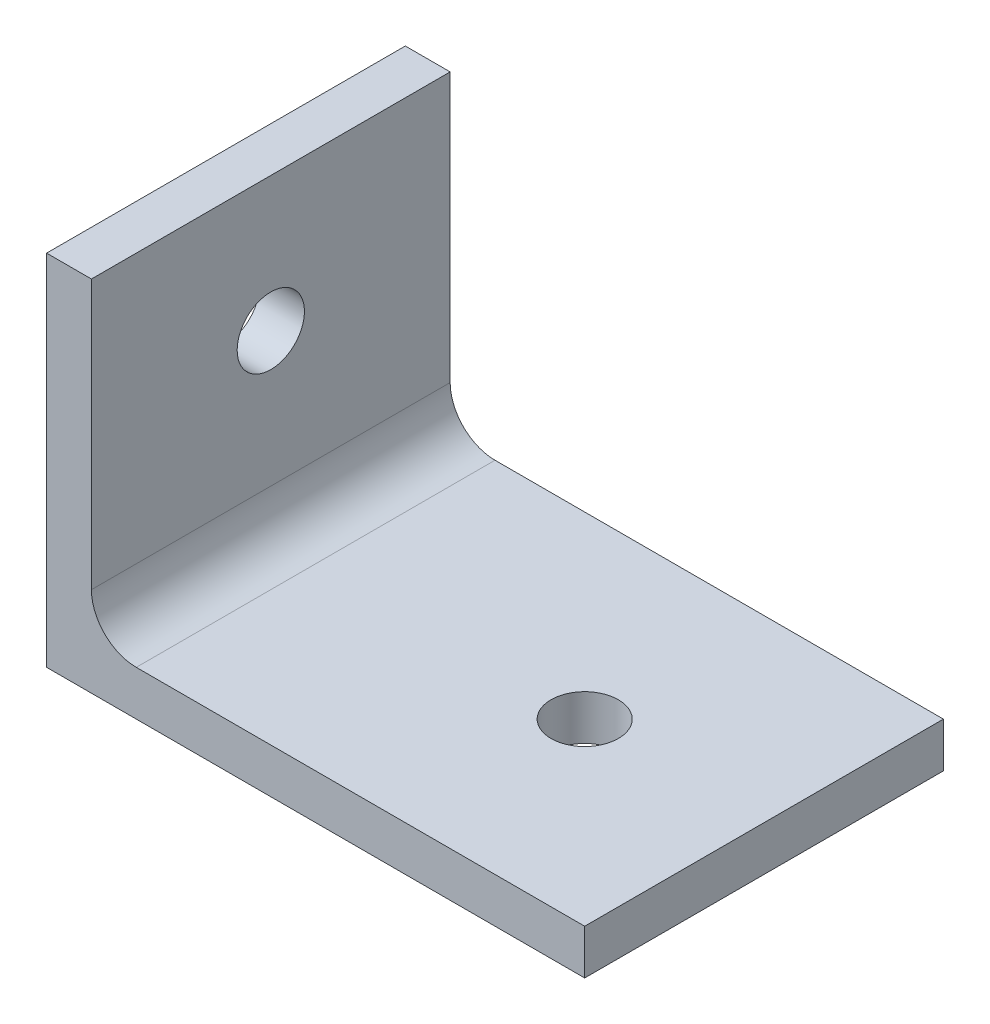
ISO-10303-21;
HEADER;
FILE_DESCRIPTION(('STEP AP214'),'2;1');
FILE_NAME('part.step','',(''),(''),'','','');
FILE_SCHEMA(('AUTOMOTIVE_DESIGN { 1 0 10303 214 1 1 1 1 }'));
ENDSEC;
DATA;
#1=APPLICATION_CONTEXT('core data for automotive mechanical design processes');
#2=APPLICATION_PROTOCOL_DEFINITION('international standard','automotive_design',2000,#1);
#3=PRODUCT_CONTEXT('',#1,'mechanical');
#4=PRODUCT('Part','Part','',(#3));
#5=PRODUCT_RELATED_PRODUCT_CATEGORY('part','',(#4));
#6=PRODUCT_DEFINITION_FORMATION('','',#4);
#7=PRODUCT_DEFINITION_CONTEXT('part definition',#1,'design');
#8=PRODUCT_DEFINITION('design','',#6,#7);
#9=PRODUCT_DEFINITION_SHAPE('','',#8);
#10=(LENGTH_UNIT() NAMED_UNIT(*) SI_UNIT(.MILLI.,.METRE.));
#11=(NAMED_UNIT(*) PLANE_ANGLE_UNIT() SI_UNIT($,.RADIAN.));
#12=(NAMED_UNIT(*) SI_UNIT($,.STERADIAN.) SOLID_ANGLE_UNIT());
#13=UNCERTAINTY_MEASURE_WITH_UNIT(LENGTH_MEASURE(1.E-05),#10,'distance_accuracy_value','');
#14=(GEOMETRIC_REPRESENTATION_CONTEXT(3) GLOBAL_UNCERTAINTY_ASSIGNED_CONTEXT((#13)) GLOBAL_UNIT_ASSIGNED_CONTEXT((#10,
#11,#12)) REPRESENTATION_CONTEXT('',''));
#15=CARTESIAN_POINT('',(0.,0.,0.));
#16=DIRECTION('',(0.,0.,1.));
#17=DIRECTION('',(1.,0.,0.));
#18=AXIS2_PLACEMENT_3D('',#15,#16,#17);
#19=CARTESIAN_POINT('',(0.,50.8,25.4));
#20=DIRECTION('',(1.,0.,0.));
#21=DIRECTION('',(0.,1.,0.));
#22=AXIS2_PLACEMENT_3D('',#19,#20,#21);
#23=PLANE('',#22);
#24=CARTESIAN_POINT('',(0.,31.75,0.));
#25=DIRECTION('',(-1.,0.,0.));
#26=DIRECTION('',(0.,0.,1.));
#27=AXIS2_PLACEMENT_3D('',#24,#25,#26);
#28=CIRCLE('',#27,4.7625);
#29=CARTESIAN_POINT('',(0.,31.75,4.7625));
#30=VERTEX_POINT('',#29);
#31=EDGE_CURVE('E161',#30,#30,#28,.T.);
#32=ORIENTED_EDGE('',*,*,#31,.F.);
#33=EDGE_LOOP('',(#32));
#34=FACE_BOUND('',#33,.T.);
#35=DIRECTION('',(0.,-1.,0.));
#36=VECTOR('',#35,1.);
#37=CARTESIAN_POINT('',(0.,50.8,-25.4));
#38=LINE('',#37,#36);
#39=CARTESIAN_POINT('',(0.,50.8,-25.4));
#40=VERTEX_POINT('',#39);
#41=CARTESIAN_POINT('',(0.,0.,-25.4));
#42=VERTEX_POINT('',#41);
#43=EDGE_CURVE('E125',#40,#42,#38,.T.);
#44=ORIENTED_EDGE('',*,*,#43,.T.);
#45=DIRECTION('',(0.,0.,-1.));
#46=VECTOR('',#45,1.);
#47=CARTESIAN_POINT('',(0.,0.,25.4));
#48=LINE('',#47,#46);
#49=CARTESIAN_POINT('',(0.,0.,25.4));
#50=VERTEX_POINT('',#49);
#51=EDGE_CURVE('E103',#50,#42,#48,.T.);
#52=ORIENTED_EDGE('',*,*,#51,.F.);
#53=DIRECTION('',(0.,-1.,0.));
#54=VECTOR('',#53,1.);
#55=CARTESIAN_POINT('',(0.,50.8,25.4));
#56=LINE('',#55,#54);
#57=CARTESIAN_POINT('',(0.,50.8,25.4));
#58=VERTEX_POINT('',#57);
#59=EDGE_CURVE('E109',#58,#50,#56,.T.);
#60=ORIENTED_EDGE('',*,*,#59,.F.);
#61=DIRECTION('',(0.,0.,-1.));
#62=VECTOR('',#61,1.);
#63=CARTESIAN_POINT('',(0.,50.8,25.4));
#64=LINE('',#63,#62);
#65=EDGE_CURVE('E140',#58,#40,#64,.T.);
#66=ORIENTED_EDGE('',*,*,#65,.T.);
#67=EDGE_LOOP('',(#44,#52,#60,#66));
#68=FACE_BOUND('',#67,.T.);
#69=ADVANCED_FACE('F39',(#34,#68),#23,.F.);
#70=CARTESIAN_POINT('',(0.,0.,25.4));
#71=DIRECTION('',(0.,1.,0.));
#72=DIRECTION('',(0.,0.,1.));
#73=AXIS2_PLACEMENT_3D('',#70,#71,#72);
#74=PLANE('',#73);
#75=CARTESIAN_POINT('',(50.8,0.,0.));
#76=DIRECTION('',(0.,1.,0.));
#77=DIRECTION('',(-1.,0.,0.));
#78=AXIS2_PLACEMENT_3D('',#75,#76,#77);
#79=CIRCLE('',#78,4.7625);
#80=CARTESIAN_POINT('',(46.0375,0.,0.));
#81=VERTEX_POINT('',#80);
#82=EDGE_CURVE('E149',#81,#81,#79,.T.);
#83=ORIENTED_EDGE('',*,*,#82,.T.);
#84=EDGE_LOOP('',(#83));
#85=FACE_BOUND('',#84,.T.);
#86=DIRECTION('',(1.,0.,0.));
#87=VECTOR('',#86,1.);
#88=CARTESIAN_POINT('',(0.,0.,-25.4));
#89=LINE('',#88,#87);
#90=CARTESIAN_POINT('',(76.2,0.,-25.4));
#91=VERTEX_POINT('',#90);
#92=EDGE_CURVE('E148',#42,#91,#89,.T.);
#93=ORIENTED_EDGE('',*,*,#92,.T.);
#94=DIRECTION('',(0.,0.,-1.));
#95=VECTOR('',#94,1.);
#96=CARTESIAN_POINT('',(76.2,0.,25.4));
#97=LINE('',#96,#95);
#98=CARTESIAN_POINT('',(76.2,0.,25.4));
#99=VERTEX_POINT('',#98);
#100=EDGE_CURVE('E106',#99,#91,#97,.T.);
#101=ORIENTED_EDGE('',*,*,#100,.F.);
#102=DIRECTION('',(1.,0.,0.));
#103=VECTOR('',#102,1.);
#104=CARTESIAN_POINT('',(0.,0.,25.4));
#105=LINE('',#104,#103);
#106=EDGE_CURVE('E97',#50,#99,#105,.T.);
#107=ORIENTED_EDGE('',*,*,#106,.F.);
#108=ORIENTED_EDGE('',*,*,#51,.T.);
#109=EDGE_LOOP('',(#93,#101,#107,#108));
#110=FACE_BOUND('',#109,.T.);
#111=ADVANCED_FACE('F101',(#85,#110),#74,.F.);
#112=CARTESIAN_POINT('',(76.2,0.,25.4));
#113=DIRECTION('',(-1.,0.,0.));
#114=DIRECTION('',(0.,0.,1.));
#115=AXIS2_PLACEMENT_3D('',#112,#113,#114);
#116=PLANE('',#115);
#117=DIRECTION('',(0.,1.,0.));
#118=VECTOR('',#117,1.);
#119=CARTESIAN_POINT('',(76.2,0.,-25.4));
#120=LINE('',#119,#118);
#121=CARTESIAN_POINT('',(76.2,6.35,-25.4));
#122=VERTEX_POINT('',#121);
#123=EDGE_CURVE('E145',#91,#122,#120,.T.);
#124=ORIENTED_EDGE('',*,*,#123,.T.);
#125=DIRECTION('',(0.,0.,-1.));
#126=VECTOR('',#125,1.);
#127=CARTESIAN_POINT('',(76.2,6.35,25.4));
#128=LINE('',#127,#126);
#129=CARTESIAN_POINT('',(76.2,6.35,25.4));
#130=VERTEX_POINT('',#129);
#131=EDGE_CURVE('E130',#130,#122,#128,.T.);
#132=ORIENTED_EDGE('',*,*,#131,.F.);
#133=DIRECTION('',(0.,1.,0.));
#134=VECTOR('',#133,1.);
#135=CARTESIAN_POINT('',(76.2,0.,25.4));
#136=LINE('',#135,#134);
#137=EDGE_CURVE('E108',#99,#130,#136,.T.);
#138=ORIENTED_EDGE('',*,*,#137,.F.);
#139=ORIENTED_EDGE('',*,*,#100,.T.);
#140=EDGE_LOOP('',(#124,#132,#138,#139));
#141=FACE_BOUND('',#140,.T.);
#142=ADVANCED_FACE('F187',(#141),#116,.F.);
#143=CARTESIAN_POINT('',(76.2,6.35,25.4));
#144=DIRECTION('',(0.,-1.,0.));
#145=DIRECTION('',(1.,0.,0.));
#146=AXIS2_PLACEMENT_3D('',#143,#144,#145);
#147=PLANE('',#146);
#148=CARTESIAN_POINT('',(50.8,6.35,0.));
#149=DIRECTION('',(0.,1.,0.));
#150=DIRECTION('',(-1.,0.,0.));
#151=AXIS2_PLACEMENT_3D('',#148,#149,#150);
#152=CIRCLE('',#151,4.7625);
#153=CARTESIAN_POINT('',(46.0375,6.35,0.));
#154=VERTEX_POINT('',#153);
#155=EDGE_CURVE('E156',#154,#154,#152,.T.);
#156=ORIENTED_EDGE('',*,*,#155,.F.);
#157=EDGE_LOOP('',(#156));
#158=FACE_BOUND('',#157,.T.);
#159=DIRECTION('',(-1.,0.,0.));
#160=VECTOR('',#159,1.);
#161=CARTESIAN_POINT('',(76.2,6.35,-25.4));
#162=LINE('',#161,#160);
#163=CARTESIAN_POINT('',(12.7,6.35,-25.4));
#164=VERTEX_POINT('',#163);
#165=EDGE_CURVE('E142',#122,#164,#162,.T.);
#166=ORIENTED_EDGE('',*,*,#165,.T.);
#167=DIRECTION('',(0.,0.,-1.));
#168=VECTOR('',#167,1.);
#169=CARTESIAN_POINT('',(12.7,6.35,25.4));
#170=LINE('',#169,#168);
#171=CARTESIAN_POINT('',(12.7,6.35,25.4));
#172=VERTEX_POINT('',#171);
#173=EDGE_CURVE('E54',#164,#172,#170,.F.);
#174=ORIENTED_EDGE('',*,*,#173,.T.);
#175=DIRECTION('',(-1.,0.,0.));
#176=VECTOR('',#175,1.);
#177=CARTESIAN_POINT('',(76.2,6.35,25.4));
#178=LINE('',#177,#176);
#179=EDGE_CURVE('E153',#130,#172,#178,.T.);
#180=ORIENTED_EDGE('',*,*,#179,.F.);
#181=ORIENTED_EDGE('',*,*,#131,.T.);
#182=EDGE_LOOP('',(#166,#174,#180,#181));
#183=FACE_BOUND('',#182,.T.);
#184=ADVANCED_FACE('F195',(#158,#183),#147,.F.);
#185=CARTESIAN_POINT('',(6.35000000000001,6.35,25.4));
#186=DIRECTION('',(-1.,0.,0.));
#187=DIRECTION('',(0.,-1.,0.));
#188=AXIS2_PLACEMENT_3D('',#185,#186,#187);
#189=PLANE('',#188);
#190=CARTESIAN_POINT('',(6.34999999999999,31.75,0.));
#191=DIRECTION('',(-1.,0.,0.));
#192=DIRECTION('',(0.,-1.,0.));
#193=AXIS2_PLACEMENT_3D('',#190,#191,#192);
#194=CIRCLE('',#193,4.7625);
#195=CARTESIAN_POINT('',(6.34999999999999,31.75,4.7625));
#196=VERTEX_POINT('',#195);
#197=EDGE_CURVE('E43',#196,#196,#194,.T.);
#198=ORIENTED_EDGE('',*,*,#197,.T.);
#199=EDGE_LOOP('',(#198));
#200=FACE_BOUND('',#199,.T.);
#201=DIRECTION('',(0.,1.,0.));
#202=VECTOR('',#201,1.);
#203=CARTESIAN_POINT('',(6.35000000000001,6.35,25.4));
#204=LINE('',#203,#202);
#205=CARTESIAN_POINT('',(6.35000000000001,12.7,25.4));
#206=VERTEX_POINT('',#205);
#207=CARTESIAN_POINT('',(6.35,50.8,25.4));
#208=VERTEX_POINT('',#207);
#209=EDGE_CURVE('E151',#206,#208,#204,.T.);
#210=ORIENTED_EDGE('',*,*,#209,.F.);
#211=DIRECTION('',(0.,0.,-1.));
#212=VECTOR('',#211,1.);
#213=CARTESIAN_POINT('',(6.35000000000001,12.7,-25.4));
#214=LINE('',#213,#212);
#215=CARTESIAN_POINT('',(6.35000000000001,12.7,-25.4));
#216=VERTEX_POINT('',#215);
#217=EDGE_CURVE('E124',#206,#216,#214,.T.);
#218=ORIENTED_EDGE('',*,*,#217,.T.);
#219=DIRECTION('',(0.,1.,0.));
#220=VECTOR('',#219,1.);
#221=CARTESIAN_POINT('',(6.35000000000001,6.35,-25.4));
#222=LINE('',#221,#220);
#223=CARTESIAN_POINT('',(6.35,50.8,-25.4));
#224=VERTEX_POINT('',#223);
#225=EDGE_CURVE('E138',#216,#224,#222,.T.);
#226=ORIENTED_EDGE('',*,*,#225,.T.);
#227=DIRECTION('',(0.,0.,-1.));
#228=VECTOR('',#227,1.);
#229=CARTESIAN_POINT('',(6.35,50.8,25.4));
#230=LINE('',#229,#228);
#231=EDGE_CURVE('E131',#208,#224,#230,.T.);
#232=ORIENTED_EDGE('',*,*,#231,.F.);
#233=EDGE_LOOP('',(#210,#218,#226,#232));
#234=FACE_BOUND('',#233,.T.);
#235=ADVANCED_FACE('F169',(#200,#234),#189,.F.);
#236=CARTESIAN_POINT('',(6.35,50.8,25.4));
#237=DIRECTION('',(0.,-1.,0.));
#238=DIRECTION('',(0.,0.,-1.));
#239=AXIS2_PLACEMENT_3D('',#236,#237,#238);
#240=PLANE('',#239);
#241=DIRECTION('',(-1.,0.,0.));
#242=VECTOR('',#241,1.);
#243=CARTESIAN_POINT('',(6.35,50.8,-25.4));
#244=LINE('',#243,#242);
#245=EDGE_CURVE('E116',#224,#40,#244,.T.);
#246=ORIENTED_EDGE('',*,*,#245,.T.);
#247=ORIENTED_EDGE('',*,*,#65,.F.);
#248=DIRECTION('',(-1.,0.,0.));
#249=VECTOR('',#248,1.);
#250=CARTESIAN_POINT('',(6.35,50.8,25.4));
#251=LINE('',#250,#249);
#252=EDGE_CURVE('E113',#208,#58,#251,.T.);
#253=ORIENTED_EDGE('',*,*,#252,.F.);
#254=ORIENTED_EDGE('',*,*,#231,.T.);
#255=EDGE_LOOP('',(#246,#247,#253,#254));
#256=FACE_BOUND('',#255,.T.);
#257=ADVANCED_FACE('F196',(#256),#240,.F.);
#258=CARTESIAN_POINT('',(0.,0.,25.4));
#259=DIRECTION('',(0.,0.,1.));
#260=DIRECTION('',(1.,0.,0.));
#261=AXIS2_PLACEMENT_3D('',#258,#259,#260);
#262=PLANE('',#261);
#263=ORIENTED_EDGE('',*,*,#59,.T.);
#264=ORIENTED_EDGE('',*,*,#106,.T.);
#265=ORIENTED_EDGE('',*,*,#137,.T.);
#266=ORIENTED_EDGE('',*,*,#179,.T.);
#267=CARTESIAN_POINT('',(12.7,12.7,25.4));
#268=DIRECTION('',(0.,0.,1.));
#269=DIRECTION('',(1.,0.,0.));
#270=AXIS2_PLACEMENT_3D('',#267,#268,#269);
#271=CIRCLE('',#270,6.35);
#272=EDGE_CURVE('E11',#172,#206,#271,.F.);
#273=ORIENTED_EDGE('',*,*,#272,.T.);
#274=ORIENTED_EDGE('',*,*,#209,.T.);
#275=ORIENTED_EDGE('',*,*,#252,.T.);
#276=EDGE_LOOP('',(#263,#264,#265,#266,#273,#274,#275));
#277=FACE_BOUND('',#276,.T.);
#278=ADVANCED_FACE('F114',(#277),#262,.T.);
#279=CARTESIAN_POINT('',(0.,0.,-25.4));
#280=DIRECTION('',(0.,0.,1.));
#281=DIRECTION('',(1.,0.,0.));
#282=AXIS2_PLACEMENT_3D('',#279,#280,#281);
#283=PLANE('',#282);
#284=ORIENTED_EDGE('',*,*,#43,.F.);
#285=ORIENTED_EDGE('',*,*,#245,.F.);
#286=ORIENTED_EDGE('',*,*,#225,.F.);
#287=CARTESIAN_POINT('',(12.7,12.7,-25.4));
#288=DIRECTION('',(0.,0.,1.));
#289=DIRECTION('',(1.,0.,0.));
#290=AXIS2_PLACEMENT_3D('',#287,#288,#289);
#291=CIRCLE('',#290,6.35);
#292=EDGE_CURVE('E48',#216,#164,#291,.T.);
#293=ORIENTED_EDGE('',*,*,#292,.T.);
#294=ORIENTED_EDGE('',*,*,#165,.F.);
#295=ORIENTED_EDGE('',*,*,#123,.F.);
#296=ORIENTED_EDGE('',*,*,#92,.F.);
#297=EDGE_LOOP('',(#284,#285,#286,#293,#294,#295,#296));
#298=FACE_BOUND('',#297,.T.);
#299=ADVANCED_FACE('F205',(#298),#283,.F.);
#300=CARTESIAN_POINT('',(12.7,12.7,25.4));
#301=DIRECTION('',(0.,0.,1.));
#302=DIRECTION('',(1.,0.,0.));
#303=AXIS2_PLACEMENT_3D('',#300,#301,#302);
#304=CYLINDRICAL_SURFACE('',#303,6.35);
#305=ORIENTED_EDGE('',*,*,#272,.F.);
#306=ORIENTED_EDGE('',*,*,#173,.F.);
#307=ORIENTED_EDGE('',*,*,#292,.F.);
#308=ORIENTED_EDGE('',*,*,#217,.F.);
#309=EDGE_LOOP('',(#305,#306,#307,#308));
#310=FACE_BOUND('',#309,.T.);
#311=ADVANCED_FACE('F41',(#310),#304,.F.);
#312=CARTESIAN_POINT('',(50.8,0.,0.));
#313=DIRECTION('',(0.,1.,0.));
#314=DIRECTION('',(-1.,0.,0.));
#315=AXIS2_PLACEMENT_3D('',#312,#313,#314);
#316=CYLINDRICAL_SURFACE('',#315,4.7625);
#317=CARTESIAN_POINT('',(46.0375,0.,0.));
#318=CARTESIAN_POINT('',(46.0375,0.0661458333333313,0.));
#319=CARTESIAN_POINT('',(46.0375,0.132291666666665,0.));
#320=CARTESIAN_POINT('',(46.0375,0.264583333333331,0.));
#321=CARTESIAN_POINT('',(46.0375,0.330729166666665,0.));
#322=CARTESIAN_POINT('',(46.0375,0.463020833333331,0.));
#323=CARTESIAN_POINT('',(46.0375,0.529166666666665,0.));
#324=CARTESIAN_POINT('',(46.0375,0.661458333333331,0.));
#325=CARTESIAN_POINT('',(46.0375,0.727604166666665,0.));
#326=CARTESIAN_POINT('',(46.0375,0.859895833333331,0.));
#327=CARTESIAN_POINT('',(46.0375,0.926041666666665,0.));
#328=CARTESIAN_POINT('',(46.0375,1.05833333333333,0.));
#329=CARTESIAN_POINT('',(46.0375,1.12447916666666,0.));
#330=CARTESIAN_POINT('',(46.0375,1.25677083333333,0.));
#331=CARTESIAN_POINT('',(46.0375,1.32291666666666,0.));
#332=CARTESIAN_POINT('',(46.0375,1.45520833333333,0.));
#333=CARTESIAN_POINT('',(46.0375,1.52135416666666,0.));
#334=CARTESIAN_POINT('',(46.0375,1.65364583333333,0.));
#335=CARTESIAN_POINT('',(46.0375,1.71979166666666,0.));
#336=CARTESIAN_POINT('',(46.0375,1.85208333333333,0.));
#337=CARTESIAN_POINT('',(46.0375,1.91822916666666,0.));
#338=CARTESIAN_POINT('',(46.0375,2.05052083333333,0.));
#339=CARTESIAN_POINT('',(46.0375,2.11666666666666,0.));
#340=CARTESIAN_POINT('',(46.0375,2.24895833333333,0.));
#341=CARTESIAN_POINT('',(46.0375,2.31510416666666,0.));
#342=CARTESIAN_POINT('',(46.0375,2.44739583333333,0.));
#343=CARTESIAN_POINT('',(46.0375,2.51354166666666,0.));
#344=CARTESIAN_POINT('',(46.0375,2.64583333333333,0.));
#345=CARTESIAN_POINT('',(46.0375,2.71197916666666,0.));
#346=CARTESIAN_POINT('',(46.0375,2.84427083333333,0.));
#347=CARTESIAN_POINT('',(46.0375,2.91041666666667,0.));
#348=CARTESIAN_POINT('',(46.0375,3.04270833333333,0.));
#349=CARTESIAN_POINT('',(46.0375,3.10885416666666,0.));
#350=CARTESIAN_POINT('',(46.0375,3.24114583333333,0.));
#351=CARTESIAN_POINT('',(46.0375,3.30729166666666,0.));
#352=CARTESIAN_POINT('',(46.0375,3.43958333333333,0.));
#353=CARTESIAN_POINT('',(46.0375,3.50572916666667,0.));
#354=CARTESIAN_POINT('',(46.0375,3.63802083333333,0.));
#355=CARTESIAN_POINT('',(46.0375,3.70416666666667,0.));
#356=CARTESIAN_POINT('',(46.0375,3.83645833333333,0.));
#357=CARTESIAN_POINT('',(46.0375,3.90260416666667,0.));
#358=CARTESIAN_POINT('',(46.0375,4.03489583333333,0.));
#359=CARTESIAN_POINT('',(46.0375,4.10104166666667,0.));
#360=CARTESIAN_POINT('',(46.0375,4.23333333333333,0.));
#361=CARTESIAN_POINT('',(46.0375,4.29947916666667,0.));
#362=CARTESIAN_POINT('',(46.0375,4.43177083333333,0.));
#363=CARTESIAN_POINT('',(46.0375,4.49791666666667,0.));
#364=CARTESIAN_POINT('',(46.0375,4.63020833333333,0.));
#365=CARTESIAN_POINT('',(46.0375,4.69635416666667,0.));
#366=CARTESIAN_POINT('',(46.0375,4.82864583333333,0.));
#367=CARTESIAN_POINT('',(46.0375,4.89479166666667,0.));
#368=CARTESIAN_POINT('',(46.0375,5.02708333333333,0.));
#369=CARTESIAN_POINT('',(46.0375,5.09322916666667,0.));
#370=CARTESIAN_POINT('',(46.0375,5.22552083333333,0.));
#371=CARTESIAN_POINT('',(46.0375,5.29166666666667,0.));
#372=CARTESIAN_POINT('',(46.0375,5.42395833333333,0.));
#373=CARTESIAN_POINT('',(46.0375,5.49010416666667,0.));
#374=CARTESIAN_POINT('',(46.0375,5.62239583333333,0.));
#375=CARTESIAN_POINT('',(46.0375,5.68854166666667,0.));
#376=CARTESIAN_POINT('',(46.0375,5.82083333333333,0.));
#377=CARTESIAN_POINT('',(46.0375,5.88697916666667,0.));
#378=CARTESIAN_POINT('',(46.0375,6.01927083333333,0.));
#379=CARTESIAN_POINT('',(46.0375,6.08541666666667,0.));
#380=CARTESIAN_POINT('',(46.0375,6.21770833333333,0.));
#381=CARTESIAN_POINT('',(46.0375,6.28385416666667,0.));
#382=CARTESIAN_POINT('',(46.0375,6.35,0.));
#383=B_SPLINE_CURVE_WITH_KNOTS('',3,(#317,#318,#319,#320,#321,#322,#323,#324,#325,#326,#327,
#328,#329,#330,#331,#332,#333,#334,#335,#336,#337,#338,#339,#340,#341,#342,#343,#344,#345,#346,
#347,#348,#349,#350,#351,#352,#353,#354,#355,#356,#357,#358,#359,#360,#361,#362,#363,#364,#365,
#366,#367,#368,#369,#370,#371,#372,#373,#374,#375,#376,#377,#378,#379,#380,#381,#382),
.UNSPECIFIED.,.F.,.F.,(4,2,2,2,2,2,2,2,2,2,2,2,2,2,2,2,2,2,2,2,2,2,2,2,2,2,2,2,2,2,2,2,4),(0.,
0.1984375,0.396875,0.5953125,0.79375,0.9921875,1.190625,1.3890625,1.5875,1.7859375,1.984375,
2.1828125,2.38125,2.5796875,2.778125,2.9765625,3.175,3.3734375,3.571875,3.7703125,3.96875,
4.1671875,4.365625,4.5640625,4.7625,4.9609375,5.159375,5.3578125,5.55625,5.7546875,5.953125,
6.1515625,6.35),.UNSPECIFIED.);
#384=EDGE_CURVE('BSEAM175',#81,#154,#383,.T.);
#385=ORIENTED_EDGE('',*,*,#82,.F.);
#386=ORIENTED_EDGE('',*,*,#155,.T.);
#387=ORIENTED_EDGE('',*,*,#384,.T.);
#388=ORIENTED_EDGE('',*,*,#384,.F.);
#389=EDGE_LOOP('',(#385,#387,#386,#388));
#390=FACE_BOUND('',#389,.T.);
#391=ADVANCED_FACE('F175',(#390),#316,.F.);
#392=CARTESIAN_POINT('',(76.2,31.75,0.));
#393=DIRECTION('',(-1.,0.,0.));
#394=DIRECTION('',(0.,0.,1.));
#395=AXIS2_PLACEMENT_3D('',#392,#393,#394);
#396=CYLINDRICAL_SURFACE('',#395,4.7625);
#397=CARTESIAN_POINT('',(0.,31.75,4.7625));
#398=CARTESIAN_POINT('',(0.0661458333333318,31.75,4.7625));
#399=CARTESIAN_POINT('',(0.132291666666664,31.75,4.7625));
#400=CARTESIAN_POINT('',(0.264583333333332,31.75,4.7625));
#401=CARTESIAN_POINT('',(0.330729166666668,31.75,4.7625));
#402=CARTESIAN_POINT('',(0.463020833333337,31.75,4.7625));
#403=CARTESIAN_POINT('',(0.529166666666669,31.75,4.7625));
#404=CARTESIAN_POINT('',(0.661458333333332,31.75,4.7625));
#405=CARTESIAN_POINT('',(0.727604166666664,31.75,4.7625));
#406=CARTESIAN_POINT('',(0.859895833333332,31.75,4.7625));
#407=CARTESIAN_POINT('',(0.926041666666669,31.75,4.7625));
#408=CARTESIAN_POINT('',(1.05833333333334,31.75,4.7625));
#409=CARTESIAN_POINT('',(1.12447916666667,31.75,4.7625));
#410=CARTESIAN_POINT('',(1.25677083333333,31.75,4.7625));
#411=CARTESIAN_POINT('',(1.32291666666666,31.75,4.7625));
#412=CARTESIAN_POINT('',(1.45520833333333,31.75,4.7625));
#413=CARTESIAN_POINT('',(1.52135416666666,31.75,4.7625));
#414=CARTESIAN_POINT('',(1.65364583333333,31.75,4.7625));
#415=CARTESIAN_POINT('',(1.71979166666666,31.75,4.7625));
#416=CARTESIAN_POINT('',(1.85208333333333,31.75,4.7625));
#417=CARTESIAN_POINT('',(1.91822916666666,31.75,4.7625));
#418=CARTESIAN_POINT('',(2.05052083333333,31.75,4.7625));
#419=CARTESIAN_POINT('',(2.11666666666666,31.75,4.7625));
#420=CARTESIAN_POINT('',(2.24895833333333,31.75,4.7625));
#421=CARTESIAN_POINT('',(2.31510416666667,31.75,4.7625));
#422=CARTESIAN_POINT('',(2.44739583333333,31.75,4.7625));
#423=CARTESIAN_POINT('',(2.51354166666667,31.75,4.7625));
#424=CARTESIAN_POINT('',(2.64583333333333,31.75,4.7625));
#425=CARTESIAN_POINT('',(2.71197916666666,31.75,4.7625));
#426=CARTESIAN_POINT('',(2.84427083333333,31.75,4.7625));
#427=CARTESIAN_POINT('',(2.91041666666667,31.75,4.7625));
#428=CARTESIAN_POINT('',(3.04270833333333,31.75,4.7625));
#429=CARTESIAN_POINT('',(3.10885416666667,31.75,4.7625));
#430=CARTESIAN_POINT('',(3.24114583333333,31.75,4.7625));
#431=CARTESIAN_POINT('',(3.30729166666666,31.75,4.7625));
#432=CARTESIAN_POINT('',(3.43958333333333,31.75,4.7625));
#433=CARTESIAN_POINT('',(3.50572916666667,31.75,4.7625));
#434=CARTESIAN_POINT('',(3.63802083333333,31.75,4.7625));
#435=CARTESIAN_POINT('',(3.70416666666667,31.75,4.7625));
#436=CARTESIAN_POINT('',(3.83645833333333,31.75,4.7625));
#437=CARTESIAN_POINT('',(3.90260416666666,31.75,4.7625));
#438=CARTESIAN_POINT('',(4.03489583333333,31.75,4.7625));
#439=CARTESIAN_POINT('',(4.10104166666667,31.75,4.7625));
#440=CARTESIAN_POINT('',(4.23333333333333,31.75,4.7625));
#441=CARTESIAN_POINT('',(4.29947916666667,31.75,4.7625));
#442=CARTESIAN_POINT('',(4.43177083333333,31.75,4.7625));
#443=CARTESIAN_POINT('',(4.49791666666666,31.75,4.7625));
#444=CARTESIAN_POINT('',(4.63020833333333,31.75,4.7625));
#445=CARTESIAN_POINT('',(4.69635416666667,31.75,4.7625));
#446=CARTESIAN_POINT('',(4.82864583333333,31.75,4.7625));
#447=CARTESIAN_POINT('',(4.89479166666667,31.75,4.7625));
#448=CARTESIAN_POINT('',(5.02708333333333,31.75,4.7625));
#449=CARTESIAN_POINT('',(5.09322916666666,31.75,4.7625));
#450=CARTESIAN_POINT('',(5.22552083333333,31.75,4.7625));
#451=CARTESIAN_POINT('',(5.29166666666666,31.75,4.7625));
#452=CARTESIAN_POINT('',(5.42395833333333,31.75,4.7625));
#453=CARTESIAN_POINT('',(5.49010416666666,31.75,4.7625));
#454=CARTESIAN_POINT('',(5.62239583333333,31.75,4.7625));
#455=CARTESIAN_POINT('',(5.68854166666666,31.75,4.7625));
#456=CARTESIAN_POINT('',(5.82083333333333,31.75,4.7625));
#457=CARTESIAN_POINT('',(5.88697916666666,31.75,4.7625));
#458=CARTESIAN_POINT('',(6.01927083333333,31.75,4.7625));
#459=CARTESIAN_POINT('',(6.08541666666666,31.75,4.7625));
#460=CARTESIAN_POINT('',(6.21770833333333,31.75,4.7625));
#461=CARTESIAN_POINT('',(6.28385416666666,31.75,4.7625));
#462=CARTESIAN_POINT('',(6.34999999999999,31.75,4.7625));
#463=B_SPLINE_CURVE_WITH_KNOTS('',3,(#397,#398,#399,#400,#401,#402,#403,#404,#405,#406,#407,
#408,#409,#410,#411,#412,#413,#414,#415,#416,#417,#418,#419,#420,#421,#422,#423,#424,#425,#426,
#427,#428,#429,#430,#431,#432,#433,#434,#435,#436,#437,#438,#439,#440,#441,#442,#443,#444,#445,
#446,#447,#448,#449,#450,#451,#452,#453,#454,#455,#456,#457,#458,#459,#460,#461,#462),
.UNSPECIFIED.,.F.,.F.,(4,2,2,2,2,2,2,2,2,2,2,2,2,2,2,2,2,2,2,2,2,2,2,2,2,2,2,2,2,2,2,2,4),(0.,
0.198437499999995,0.396875000000005,0.5953125,0.793749999999996,0.992187500000005,1.190625,
1.3890625,1.58749999999999,1.7859375,1.984375,2.18281249999999,2.38125,2.5796875,
2.77812499999999,2.9765625,3.175,3.37343749999999,3.571875,3.7703125,3.96874999999999,4.1671875,
4.365625,4.56406249999999,4.7625,4.9609375,5.15937499999999,5.35781249999999,5.55625,
5.75468749999999,5.95312499999999,6.1515625,6.34999999999999),.UNSPECIFIED.);
#464=EDGE_CURVE('BSEAM172',#30,#196,#463,.T.);
#465=ORIENTED_EDGE('',*,*,#31,.T.);
#466=ORIENTED_EDGE('',*,*,#197,.F.);
#467=ORIENTED_EDGE('',*,*,#464,.T.);
#468=ORIENTED_EDGE('',*,*,#464,.F.);
#469=EDGE_LOOP('',(#465,#467,#466,#468));
#470=FACE_BOUND('',#469,.T.);
#471=ADVANCED_FACE('F172',(#470),#396,.F.);
#472=CLOSED_SHELL('',(#69,#111,#142,#184,#235,#257,#278,#299,#311,#391,#471));
#473=MANIFOLD_SOLID_BREP('B2',#472);
#474=ADVANCED_BREP_SHAPE_REPRESENTATION('',(#18,#473),#14);
#475=SHAPE_DEFINITION_REPRESENTATION(#9,#474);
ENDSEC;
END-ISO-10303-21;
